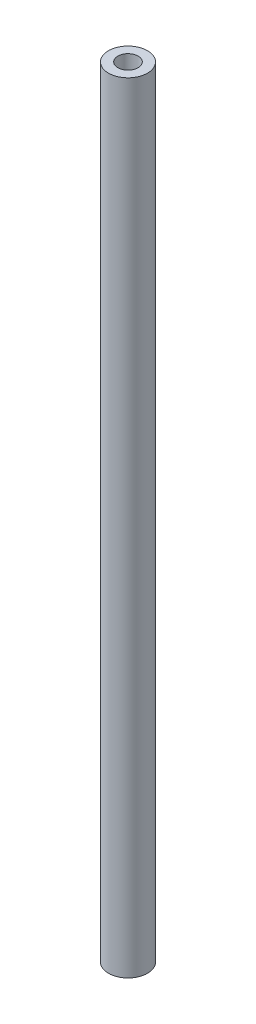
ISO-10303-21;
HEADER;
FILE_DESCRIPTION(('STEP AP214'),'2;1');
FILE_NAME('part.step','',(''),(''),'','','');
FILE_SCHEMA(('AUTOMOTIVE_DESIGN { 1 0 10303 214 1 1 1 1 }'));
ENDSEC;
DATA;
#1=APPLICATION_CONTEXT('core data for automotive mechanical design processes');
#2=APPLICATION_PROTOCOL_DEFINITION('international standard','automotive_design',2000,#1);
#3=PRODUCT_CONTEXT('',#1,'mechanical');
#4=PRODUCT('Part','Part','',(#3));
#5=PRODUCT_RELATED_PRODUCT_CATEGORY('part','',(#4));
#6=PRODUCT_DEFINITION_FORMATION('','',#4);
#7=PRODUCT_DEFINITION_CONTEXT('part definition',#1,'design');
#8=PRODUCT_DEFINITION('design','',#6,#7);
#9=PRODUCT_DEFINITION_SHAPE('','',#8);
#10=(LENGTH_UNIT() NAMED_UNIT(*) SI_UNIT(.MILLI.,.METRE.));
#11=(NAMED_UNIT(*) PLANE_ANGLE_UNIT() SI_UNIT($,.RADIAN.));
#12=(NAMED_UNIT(*) SI_UNIT($,.STERADIAN.) SOLID_ANGLE_UNIT());
#13=UNCERTAINTY_MEASURE_WITH_UNIT(LENGTH_MEASURE(1.E-05),#10,'distance_accuracy_value','');
#14=(GEOMETRIC_REPRESENTATION_CONTEXT(3) GLOBAL_UNCERTAINTY_ASSIGNED_CONTEXT((#13)) GLOBAL_UNIT_ASSIGNED_CONTEXT((#10,
#11,#12)) REPRESENTATION_CONTEXT('',''));
#15=CARTESIAN_POINT('',(0.,0.,0.));
#16=DIRECTION('',(0.,0.,1.));
#17=DIRECTION('',(1.,0.,0.));
#18=AXIS2_PLACEMENT_3D('',#15,#16,#17);
#19=CARTESIAN_POINT('',(0.,200.,0.));
#20=DIRECTION('',(0.,-1.,0.));
#21=DIRECTION('',(0.,0.,-1.));
#22=AXIS2_PLACEMENT_3D('',#19,#20,#21);
#23=CYLINDRICAL_SURFACE('',#22,5.);
#24=CARTESIAN_POINT('',(0.,200.,0.));
#25=DIRECTION('',(0.,1.,0.));
#26=DIRECTION('',(0.,0.,1.));
#27=AXIS2_PLACEMENT_3D('',#24,#25,#26);
#28=CIRCLE('',#27,5.);
#29=CARTESIAN_POINT('',(0.,200.,5.));
#30=VERTEX_POINT('',#29);
#31=EDGE_CURVE('E10',#30,#30,#28,.T.);
#32=ORIENTED_EDGE('',*,*,#31,.F.);
#33=EDGE_LOOP('',(#32));
#34=FACE_BOUND('',#33,.T.);
#35=CARTESIAN_POINT('',(0.,0.,0.));
#36=DIRECTION('',(0.,1.,0.));
#37=DIRECTION('',(0.,0.,1.));
#38=AXIS2_PLACEMENT_3D('',#35,#36,#37);
#39=CIRCLE('',#38,5.);
#40=CARTESIAN_POINT('',(0.,0.,5.));
#41=VERTEX_POINT('',#40);
#42=EDGE_CURVE('E35',#41,#41,#39,.T.);
#43=ORIENTED_EDGE('',*,*,#42,.T.);
#44=EDGE_LOOP('',(#43));
#45=FACE_BOUND('',#44,.T.);
#46=ADVANCED_FACE('F32',(#34,#45),#23,.T.);
#47=CARTESIAN_POINT('',(0.,200.,0.));
#48=DIRECTION('',(0.,1.,0.));
#49=DIRECTION('',(0.,0.,1.));
#50=AXIS2_PLACEMENT_3D('',#47,#48,#49);
#51=PLANE('',#50);
#52=CARTESIAN_POINT('',(0.,200.,0.));
#53=DIRECTION('',(0.,1.,0.));
#54=DIRECTION('',(0.,0.,1.));
#55=AXIS2_PLACEMENT_3D('',#52,#53,#54);
#56=CIRCLE('',#55,2.6);
#57=CARTESIAN_POINT('',(0.,200.,2.6));
#58=VERTEX_POINT('',#57);
#59=EDGE_CURVE('E50',#58,#58,#56,.T.);
#60=ORIENTED_EDGE('',*,*,#59,.F.);
#61=EDGE_LOOP('',(#60));
#62=FACE_BOUND('',#61,.T.);
#63=ORIENTED_EDGE('',*,*,#31,.T.);
#64=EDGE_LOOP('',(#63));
#65=FACE_BOUND('',#64,.T.);
#66=ADVANCED_FACE('F65',(#62,#65),#51,.T.);
#67=CARTESIAN_POINT('',(0.,0.,0.));
#68=DIRECTION('',(0.,1.,0.));
#69=DIRECTION('',(0.,0.,1.));
#70=AXIS2_PLACEMENT_3D('',#67,#68,#69);
#71=PLANE('',#70);
#72=CARTESIAN_POINT('',(0.,0.,0.));
#73=DIRECTION('',(0.,-1.,0.));
#74=DIRECTION('',(0.,0.,-1.));
#75=AXIS2_PLACEMENT_3D('',#72,#73,#74);
#76=CIRCLE('',#75,2.6);
#77=CARTESIAN_POINT('',(0.,0.,-2.6));
#78=VERTEX_POINT('',#77);
#79=EDGE_CURVE('E44',#78,#78,#76,.T.);
#80=ORIENTED_EDGE('',*,*,#79,.F.);
#81=EDGE_LOOP('',(#80));
#82=FACE_BOUND('',#81,.T.);
#83=ORIENTED_EDGE('',*,*,#42,.F.);
#84=EDGE_LOOP('',(#83));
#85=FACE_BOUND('',#84,.T.);
#86=ADVANCED_FACE('F67',(#82,#85),#71,.F.);
#87=CARTESIAN_POINT('',(0.,10.,0.));
#88=DIRECTION('',(0.,-1.,0.));
#89=DIRECTION('',(0.,0.,-1.));
#90=AXIS2_PLACEMENT_3D('',#87,#88,#89);
#91=CYLINDRICAL_SURFACE('',#90,2.6);
#92=CARTESIAN_POINT('',(0.,10.,0.));
#93=DIRECTION('',(0.,-1.,0.));
#94=DIRECTION('',(0.,0.,-1.));
#95=AXIS2_PLACEMENT_3D('',#92,#93,#94);
#96=CIRCLE('',#95,2.6);
#97=CARTESIAN_POINT('',(0.,10.,-2.6));
#98=VERTEX_POINT('',#97);
#99=EDGE_CURVE('E42',#98,#98,#96,.T.);
#100=ORIENTED_EDGE('',*,*,#99,.F.);
#101=EDGE_LOOP('',(#100));
#102=FACE_BOUND('',#101,.T.);
#103=ORIENTED_EDGE('',*,*,#79,.T.);
#104=EDGE_LOOP('',(#103));
#105=FACE_BOUND('',#104,.T.);
#106=ADVANCED_FACE('F73',(#102,#105),#91,.F.);
#107=CARTESIAN_POINT('',(0.,10.,0.));
#108=DIRECTION('',(0.,-1.,0.));
#109=DIRECTION('',(0.,0.,-1.));
#110=AXIS2_PLACEMENT_3D('',#107,#108,#109);
#111=PLANE('',#110);
#112=ORIENTED_EDGE('',*,*,#99,.T.);
#113=EDGE_LOOP('',(#112));
#114=FACE_BOUND('',#113,.T.);
#115=ADVANCED_FACE('F61',(#114),#111,.T.);
#116=CARTESIAN_POINT('',(0.,190.,0.));
#117=DIRECTION('',(0.,1.,0.));
#118=DIRECTION('',(0.,0.,1.));
#119=AXIS2_PLACEMENT_3D('',#116,#117,#118);
#120=CYLINDRICAL_SURFACE('',#119,2.6);
#121=CARTESIAN_POINT('',(0.,190.,0.));
#122=DIRECTION('',(0.,1.,0.));
#123=DIRECTION('',(0.,0.,1.));
#124=AXIS2_PLACEMENT_3D('',#121,#122,#123);
#125=CIRCLE('',#124,2.6);
#126=CARTESIAN_POINT('',(0.,190.,2.6));
#127=VERTEX_POINT('',#126);
#128=EDGE_CURVE('E47',#127,#127,#125,.T.);
#129=ORIENTED_EDGE('',*,*,#128,.F.);
#130=EDGE_LOOP('',(#129));
#131=FACE_BOUND('',#130,.T.);
#132=ORIENTED_EDGE('',*,*,#59,.T.);
#133=EDGE_LOOP('',(#132));
#134=FACE_BOUND('',#133,.T.);
#135=ADVANCED_FACE('F58',(#131,#134),#120,.F.);
#136=CARTESIAN_POINT('',(0.,190.,0.));
#137=DIRECTION('',(0.,1.,0.));
#138=DIRECTION('',(0.,0.,1.));
#139=AXIS2_PLACEMENT_3D('',#136,#137,#138);
#140=PLANE('',#139);
#141=ORIENTED_EDGE('',*,*,#128,.T.);
#142=EDGE_LOOP('',(#141));
#143=FACE_BOUND('',#142,.T.);
#144=ADVANCED_FACE('F56',(#143),#140,.T.);
#145=CLOSED_SHELL('',(#46,#66,#86,#106,#115,#135,#144));
#146=MANIFOLD_SOLID_BREP('B2',#145);
#147=ADVANCED_BREP_SHAPE_REPRESENTATION('',(#18,#146),#14);
#148=SHAPE_DEFINITION_REPRESENTATION(#9,#147);
ENDSEC;
END-ISO-10303-21;
